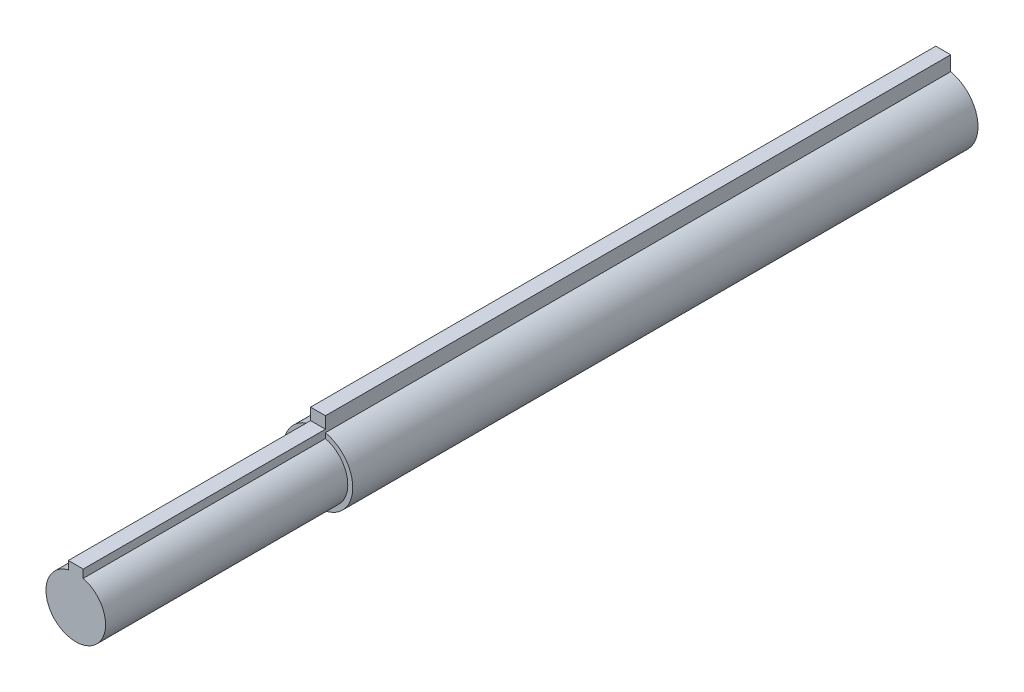
ISO-10303-21;
HEADER;
FILE_DESCRIPTION(('STEP AP214'),'2;1');
FILE_NAME('part.step','',(''),(''),'','','');
FILE_SCHEMA(('AUTOMOTIVE_DESIGN { 1 0 10303 214 1 1 1 1 }'));
ENDSEC;
DATA;
#1=APPLICATION_CONTEXT('core data for automotive mechanical design processes');
#2=APPLICATION_PROTOCOL_DEFINITION('international standard','automotive_design',2000,#1);
#3=PRODUCT_CONTEXT('',#1,'mechanical');
#4=PRODUCT('Part','Part','',(#3));
#5=PRODUCT_RELATED_PRODUCT_CATEGORY('part','',(#4));
#6=PRODUCT_DEFINITION_FORMATION('','',#4);
#7=PRODUCT_DEFINITION_CONTEXT('part definition',#1,'design');
#8=PRODUCT_DEFINITION('design','',#6,#7);
#9=PRODUCT_DEFINITION_SHAPE('','',#8);
#10=(LENGTH_UNIT() NAMED_UNIT(*) SI_UNIT(.MILLI.,.METRE.));
#11=(NAMED_UNIT(*) PLANE_ANGLE_UNIT() SI_UNIT($,.RADIAN.));
#12=(NAMED_UNIT(*) SI_UNIT($,.STERADIAN.) SOLID_ANGLE_UNIT());
#13=UNCERTAINTY_MEASURE_WITH_UNIT(LENGTH_MEASURE(1.E-05),#10,'distance_accuracy_value','');
#14=(GEOMETRIC_REPRESENTATION_CONTEXT(3) GLOBAL_UNCERTAINTY_ASSIGNED_CONTEXT((#13)) GLOBAL_UNIT_ASSIGNED_CONTEXT((#10,
#11,#12)) REPRESENTATION_CONTEXT('',''));
#15=CARTESIAN_POINT('',(0.,0.,0.));
#16=DIRECTION('',(0.,0.,1.));
#17=DIRECTION('',(1.,0.,0.));
#18=AXIS2_PLACEMENT_3D('',#15,#16,#17);
#19=CARTESIAN_POINT('',(-2.38,11.8180279583452,77.48));
#20=DIRECTION('',(1.,0.,0.));
#21=DIRECTION('',(0.,0.,-1.));
#22=AXIS2_PLACEMENT_3D('',#19,#20,#21);
#23=PLANE('',#22);
#24=DIRECTION('',(0.,0.,-1.));
#25=VECTOR('',#24,1.);
#26=CARTESIAN_POINT('',(-2.38,11.8180279583452,77.48));
#27=LINE('',#26,#25);
#28=CARTESIAN_POINT('',(-2.38,11.8180279583452,77.48));
#29=VERTEX_POINT('',#28);
#30=CARTESIAN_POINT('',(-2.38,11.8180279583452,0.));
#31=VERTEX_POINT('',#30);
#32=EDGE_CURVE('E62',#29,#31,#27,.T.);
#33=ORIENTED_EDGE('',*,*,#32,.T.);
#34=DIRECTION('',(0.,1.,0.));
#35=VECTOR('',#34,1.);
#36=CARTESIAN_POINT('',(-2.38,15.5572015270971,0.));
#37=LINE('',#36,#35);
#38=CARTESIAN_POINT('',(-2.38,15.5572015270971,0.));
#39=VERTEX_POINT('',#38);
#40=EDGE_CURVE('E183',#31,#39,#37,.T.);
#41=ORIENTED_EDGE('',*,*,#40,.T.);
#42=DIRECTION('',(0.,0.,1.));
#43=VECTOR('',#42,1.);
#44=CARTESIAN_POINT('',(-2.38,15.5572015270971,-200.));
#45=LINE('',#44,#43);
#46=CARTESIAN_POINT('',(-2.38,15.5572015270971,-200.));
#47=VERTEX_POINT('',#46);
#48=EDGE_CURVE('E115',#47,#39,#45,.T.);
#49=ORIENTED_EDGE('',*,*,#48,.F.);
#50=DIRECTION('',(0.,1.,0.));
#51=VECTOR('',#50,1.);
#52=CARTESIAN_POINT('',(-2.38,15.5572015270971,-200.));
#53=LINE('',#52,#51);
#54=CARTESIAN_POINT('',(-2.38,10.8572015270971,-200.));
#55=VERTEX_POINT('',#54);
#56=EDGE_CURVE('E108',#55,#47,#53,.T.);
#57=ORIENTED_EDGE('',*,*,#56,.F.);
#58=DIRECTION('',(0.,0.,1.));
#59=VECTOR('',#58,1.);
#60=CARTESIAN_POINT('',(-2.38,10.8572015270971,-200.));
#61=LINE('',#60,#59);
#62=CARTESIAN_POINT('',(-2.38,10.8572015270971,0.));
#63=VERTEX_POINT('',#62);
#64=EDGE_CURVE('E112',#55,#63,#61,.T.);
#65=ORIENTED_EDGE('',*,*,#64,.T.);
#66=DIRECTION('',(0.,-1.,0.));
#67=VECTOR('',#66,1.);
#68=CARTESIAN_POINT('',(-2.38,11.8180279583452,0.));
#69=LINE('',#68,#67);
#70=CARTESIAN_POINT('',(-2.38,9.22802795834516,0.));
#71=VERTEX_POINT('',#70);
#72=EDGE_CURVE('E132',#63,#71,#69,.T.);
#73=ORIENTED_EDGE('',*,*,#72,.T.);
#74=DIRECTION('',(0.,0.,-1.));
#75=VECTOR('',#74,1.);
#76=CARTESIAN_POINT('',(-2.38,9.22802795834516,77.48));
#77=LINE('',#76,#75);
#78=CARTESIAN_POINT('',(-2.38,9.22802795834516,77.48));
#79=VERTEX_POINT('',#78);
#80=EDGE_CURVE('E11',#79,#71,#77,.T.);
#81=ORIENTED_EDGE('',*,*,#80,.F.);
#82=DIRECTION('',(0.,-1.,0.));
#83=VECTOR('',#82,1.);
#84=CARTESIAN_POINT('',(-2.38,11.8180279583452,77.48));
#85=LINE('',#84,#83);
#86=EDGE_CURVE('E140',#29,#79,#85,.T.);
#87=ORIENTED_EDGE('',*,*,#86,.F.);
#88=EDGE_LOOP('',(#33,#41,#49,#57,#65,#73,#81,#87));
#89=FACE_BOUND('',#88,.T.);
#90=ADVANCED_FACE('F47',(#89),#23,.F.);
#91=CARTESIAN_POINT('',(0.,0.,77.48));
#92=DIRECTION('',(0.,0.,-1.));
#93=DIRECTION('',(-1.,0.,0.));
#94=AXIS2_PLACEMENT_3D('',#91,#92,#93);
#95=CYLINDRICAL_SURFACE('',#94,9.53);
#96=CARTESIAN_POINT('',(0.,0.,0.));
#97=DIRECTION('',(0.,0.,1.));
#98=DIRECTION('',(1.,0.,0.));
#99=AXIS2_PLACEMENT_3D('',#96,#97,#98);
#100=CIRCLE('',#99,9.53);
#101=CARTESIAN_POINT('',(2.38,9.22802795834516,0.));
#102=VERTEX_POINT('',#101);
#103=EDGE_CURVE('E134',#71,#102,#100,.T.);
#104=ORIENTED_EDGE('',*,*,#103,.T.);
#105=DIRECTION('',(0.,0.,-1.));
#106=VECTOR('',#105,1.);
#107=CARTESIAN_POINT('',(2.38,9.22802795834516,77.48));
#108=LINE('',#107,#106);
#109=CARTESIAN_POINT('',(2.38,9.22802795834516,77.48));
#110=VERTEX_POINT('',#109);
#111=EDGE_CURVE('E55',#110,#102,#108,.T.);
#112=ORIENTED_EDGE('',*,*,#111,.F.);
#113=CARTESIAN_POINT('',(0.,0.,77.48));
#114=DIRECTION('',(0.,0.,1.));
#115=DIRECTION('',(1.,0.,0.));
#116=AXIS2_PLACEMENT_3D('',#113,#114,#115);
#117=CIRCLE('',#116,9.53);
#118=EDGE_CURVE('E143',#79,#110,#117,.T.);
#119=ORIENTED_EDGE('',*,*,#118,.F.);
#120=ORIENTED_EDGE('',*,*,#80,.T.);
#121=EDGE_LOOP('',(#104,#112,#119,#120));
#122=FACE_BOUND('',#121,.T.);
#123=ADVANCED_FACE('F167',(#122),#95,.T.);
#124=CARTESIAN_POINT('',(2.38,11.8180279583452,77.48));
#125=DIRECTION('',(1.,0.,0.));
#126=DIRECTION('',(0.,1.,0.));
#127=AXIS2_PLACEMENT_3D('',#124,#125,#126);
#128=PLANE('',#127);
#129=DIRECTION('',(0.,-1.,0.));
#130=VECTOR('',#129,1.);
#131=CARTESIAN_POINT('',(2.38,11.8180279583452,0.));
#132=LINE('',#131,#130);
#133=CARTESIAN_POINT('',(2.38,10.8572015270971,0.));
#134=VERTEX_POINT('',#133);
#135=EDGE_CURVE('E153',#134,#102,#132,.T.);
#136=ORIENTED_EDGE('',*,*,#135,.F.);
#137=DIRECTION('',(0.,0.,1.));
#138=VECTOR('',#137,1.);
#139=CARTESIAN_POINT('',(2.38,10.8572015270971,-200.));
#140=LINE('',#139,#138);
#141=CARTESIAN_POINT('',(2.38,10.8572015270971,-200.));
#142=VERTEX_POINT('',#141);
#143=EDGE_CURVE('E187',#142,#134,#140,.T.);
#144=ORIENTED_EDGE('',*,*,#143,.F.);
#145=DIRECTION('',(0.,-1.,0.));
#146=VECTOR('',#145,1.);
#147=CARTESIAN_POINT('',(2.38,15.5572015270971,-200.));
#148=LINE('',#147,#146);
#149=CARTESIAN_POINT('',(2.38,15.5572015270971,-200.));
#150=VERTEX_POINT('',#149);
#151=EDGE_CURVE('E124',#150,#142,#148,.T.);
#152=ORIENTED_EDGE('',*,*,#151,.F.);
#153=DIRECTION('',(0.,0.,1.));
#154=VECTOR('',#153,1.);
#155=CARTESIAN_POINT('',(2.38,15.5572015270971,-200.));
#156=LINE('',#155,#154);
#157=CARTESIAN_POINT('',(2.38,15.5572015270971,0.));
#158=VERTEX_POINT('',#157);
#159=EDGE_CURVE('E136',#150,#158,#156,.T.);
#160=ORIENTED_EDGE('',*,*,#159,.T.);
#161=DIRECTION('',(0.,-1.,0.));
#162=VECTOR('',#161,1.);
#163=CARTESIAN_POINT('',(2.38,15.5572015270971,0.));
#164=LINE('',#163,#162);
#165=CARTESIAN_POINT('',(2.38,11.8180279583452,0.));
#166=VERTEX_POINT('',#165);
#167=EDGE_CURVE('E127',#158,#166,#164,.T.);
#168=ORIENTED_EDGE('',*,*,#167,.T.);
#169=DIRECTION('',(0.,0.,-1.));
#170=VECTOR('',#169,1.);
#171=CARTESIAN_POINT('',(2.38,11.8180279583452,77.48));
#172=LINE('',#171,#170);
#173=CARTESIAN_POINT('',(2.38,11.8180279583452,77.48));
#174=VERTEX_POINT('',#173);
#175=EDGE_CURVE('E158',#174,#166,#172,.T.);
#176=ORIENTED_EDGE('',*,*,#175,.F.);
#177=DIRECTION('',(0.,-1.,0.));
#178=VECTOR('',#177,1.);
#179=CARTESIAN_POINT('',(2.38,11.8180279583452,77.48));
#180=LINE('',#179,#178);
#181=EDGE_CURVE('E146',#174,#110,#180,.T.);
#182=ORIENTED_EDGE('',*,*,#181,.T.);
#183=ORIENTED_EDGE('',*,*,#111,.T.);
#184=EDGE_LOOP('',(#136,#144,#152,#160,#168,#176,#182,#183));
#185=FACE_BOUND('',#184,.T.);
#186=ADVANCED_FACE('F164',(#185),#128,.T.);
#187=CARTESIAN_POINT('',(-2.38,11.8180279583452,77.48));
#188=DIRECTION('',(0.,1.,0.));
#189=DIRECTION('',(0.,0.,1.));
#190=AXIS2_PLACEMENT_3D('',#187,#188,#189);
#191=PLANE('',#190);
#192=DIRECTION('',(1.,0.,0.));
#193=VECTOR('',#192,1.);
#194=CARTESIAN_POINT('',(-2.38,11.8180279583452,0.));
#195=LINE('',#194,#193);
#196=EDGE_CURVE('E144',#31,#166,#195,.T.);
#197=ORIENTED_EDGE('',*,*,#196,.F.);
#198=ORIENTED_EDGE('',*,*,#32,.F.);
#199=DIRECTION('',(1.,0.,0.));
#200=VECTOR('',#199,1.);
#201=CARTESIAN_POINT('',(-2.38,11.8180279583452,77.48));
#202=LINE('',#201,#200);
#203=EDGE_CURVE('E149',#29,#174,#202,.T.);
#204=ORIENTED_EDGE('',*,*,#203,.T.);
#205=ORIENTED_EDGE('',*,*,#175,.T.);
#206=EDGE_LOOP('',(#197,#198,#204,#205));
#207=FACE_BOUND('',#206,.T.);
#208=ADVANCED_FACE('F174',(#207),#191,.T.);
#209=CARTESIAN_POINT('',(0.,0.,77.48));
#210=DIRECTION('',(0.,0.,1.));
#211=DIRECTION('',(1.,0.,0.));
#212=AXIS2_PLACEMENT_3D('',#209,#210,#211);
#213=PLANE('',#212);
#214=ORIENTED_EDGE('',*,*,#86,.T.);
#215=ORIENTED_EDGE('',*,*,#118,.T.);
#216=ORIENTED_EDGE('',*,*,#181,.F.);
#217=ORIENTED_EDGE('',*,*,#203,.F.);
#218=EDGE_LOOP('',(#214,#215,#216,#217));
#219=FACE_BOUND('',#218,.T.);
#220=ADVANCED_FACE('F173',(#219),#213,.T.);
#221=CARTESIAN_POINT('',(0.,0.,0.));
#222=DIRECTION('',(0.,0.,-1.));
#223=DIRECTION('',(-1.,0.,0.));
#224=AXIS2_PLACEMENT_3D('',#221,#222,#223);
#225=PLANE('',#224);
#226=ORIENTED_EDGE('',*,*,#72,.F.);
#227=CARTESIAN_POINT('',(0.,0.,0.));
#228=DIRECTION('',(0.,0.,-1.));
#229=DIRECTION('',(-1.,0.,0.));
#230=AXIS2_PLACEMENT_3D('',#227,#228,#229);
#231=CIRCLE('',#230,11.115);
#232=EDGE_CURVE('E131',#134,#63,#231,.T.);
#233=ORIENTED_EDGE('',*,*,#232,.F.);
#234=ORIENTED_EDGE('',*,*,#135,.T.);
#235=ORIENTED_EDGE('',*,*,#103,.F.);
#236=EDGE_LOOP('',(#226,#233,#234,#235));
#237=FACE_BOUND('',#236,.T.);
#238=ADVANCED_FACE('F170',(#237),#225,.F.);
#239=CARTESIAN_POINT('',(0.,0.,-200.));
#240=DIRECTION('',(0.,0.,1.));
#241=DIRECTION('',(1.,0.,0.));
#242=AXIS2_PLACEMENT_3D('',#239,#240,#241);
#243=CYLINDRICAL_SURFACE('',#242,11.115);
#244=ORIENTED_EDGE('',*,*,#232,.T.);
#245=ORIENTED_EDGE('',*,*,#64,.F.);
#246=CARTESIAN_POINT('',(0.,0.,-200.));
#247=DIRECTION('',(0.,0.,-1.));
#248=DIRECTION('',(-1.,0.,0.));
#249=AXIS2_PLACEMENT_3D('',#246,#247,#248);
#250=CIRCLE('',#249,11.115);
#251=EDGE_CURVE('E119',#142,#55,#250,.T.);
#252=ORIENTED_EDGE('',*,*,#251,.F.);
#253=ORIENTED_EDGE('',*,*,#143,.T.);
#254=EDGE_LOOP('',(#244,#245,#252,#253));
#255=FACE_BOUND('',#254,.T.);
#256=ADVANCED_FACE('F129',(#255),#243,.T.);
#257=CARTESIAN_POINT('',(2.38,15.5572015270971,-200.));
#258=DIRECTION('',(0.,-1.,0.));
#259=DIRECTION('',(0.,0.,-1.));
#260=AXIS2_PLACEMENT_3D('',#257,#258,#259);
#261=PLANE('',#260);
#262=DIRECTION('',(1.,0.,0.));
#263=VECTOR('',#262,1.);
#264=CARTESIAN_POINT('',(2.38,15.5572015270971,0.));
#265=LINE('',#264,#263);
#266=EDGE_CURVE('E181',#39,#158,#265,.T.);
#267=ORIENTED_EDGE('',*,*,#266,.T.);
#268=ORIENTED_EDGE('',*,*,#159,.F.);
#269=DIRECTION('',(1.,0.,0.));
#270=VECTOR('',#269,1.);
#271=CARTESIAN_POINT('',(2.38,15.5572015270971,-200.));
#272=LINE('',#271,#270);
#273=EDGE_CURVE('E118',#47,#150,#272,.T.);
#274=ORIENTED_EDGE('',*,*,#273,.F.);
#275=ORIENTED_EDGE('',*,*,#48,.T.);
#276=EDGE_LOOP('',(#267,#268,#274,#275));
#277=FACE_BOUND('',#276,.T.);
#278=ADVANCED_FACE('F192',(#277),#261,.F.);
#279=CARTESIAN_POINT('',(0.,0.,-200.));
#280=DIRECTION('',(0.,0.,-1.));
#281=DIRECTION('',(-1.,0.,0.));
#282=AXIS2_PLACEMENT_3D('',#279,#280,#281);
#283=PLANE('',#282);
#284=ORIENTED_EDGE('',*,*,#251,.T.);
#285=ORIENTED_EDGE('',*,*,#56,.T.);
#286=ORIENTED_EDGE('',*,*,#273,.T.);
#287=ORIENTED_EDGE('',*,*,#151,.T.);
#288=EDGE_LOOP('',(#284,#285,#286,#287));
#289=FACE_BOUND('',#288,.T.);
#290=ADVANCED_FACE('F122',(#289),#283,.T.);
#291=ORIENTED_EDGE('',*,*,#40,.F.);
#292=ORIENTED_EDGE('',*,*,#196,.T.);
#293=ORIENTED_EDGE('',*,*,#167,.F.);
#294=ORIENTED_EDGE('',*,*,#266,.F.);
#295=EDGE_LOOP('',(#291,#292,#293,#294));
#296=FACE_BOUND('',#295,.T.);
#297=ADVANCED_FACE('F193',(#296),#225,.F.);
#298=CLOSED_SHELL('',(#90,#123,#186,#208,#220,#238,#256,#278,#290,#297));
#299=MANIFOLD_SOLID_BREP('B2',#298);
#300=ADVANCED_BREP_SHAPE_REPRESENTATION('',(#18,#299),#14);
#301=SHAPE_DEFINITION_REPRESENTATION(#9,#300);
ENDSEC;
END-ISO-10303-21;
